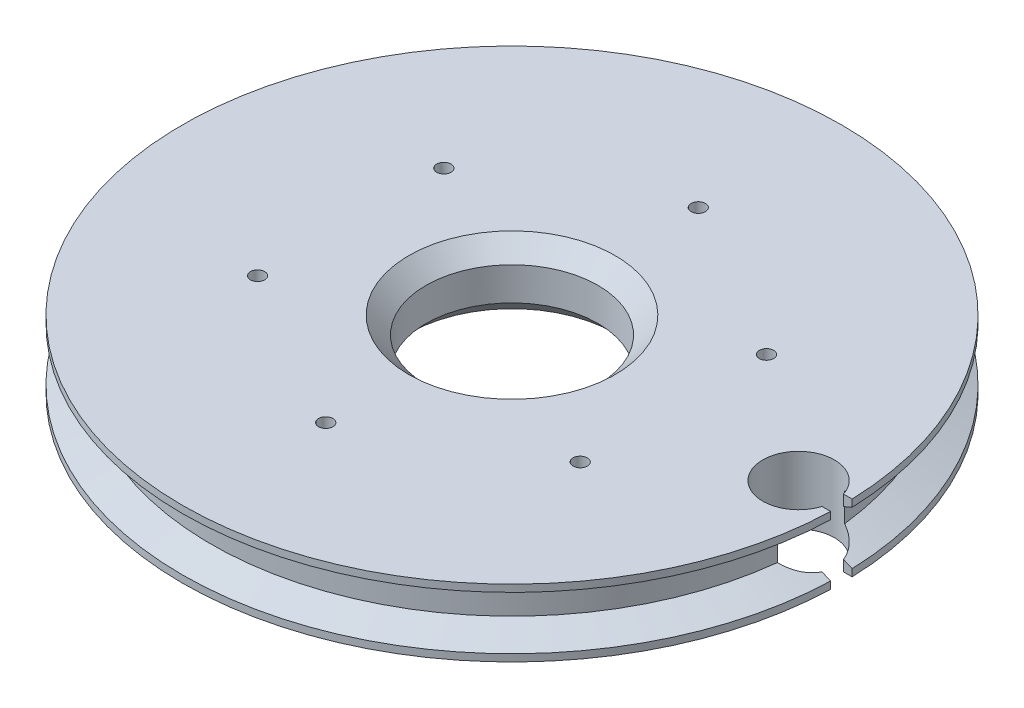
ISO-10303-21;
HEADER;
FILE_DESCRIPTION(('STEP AP214'),'2;1');
FILE_NAME('part.step','',(''),(''),'','','');
FILE_SCHEMA(('AUTOMOTIVE_DESIGN { 1 0 10303 214 1 1 1 1 }'));
ENDSEC;
DATA;
#1=APPLICATION_CONTEXT('core data for automotive mechanical design processes');
#2=APPLICATION_PROTOCOL_DEFINITION('international standard','automotive_design',2000,#1);
#3=PRODUCT_CONTEXT('',#1,'mechanical');
#4=PRODUCT('Part','Part','',(#3));
#5=PRODUCT_RELATED_PRODUCT_CATEGORY('part','',(#4));
#6=PRODUCT_DEFINITION_FORMATION('','',#4);
#7=PRODUCT_DEFINITION_CONTEXT('part definition',#1,'design');
#8=PRODUCT_DEFINITION('design','',#6,#7);
#9=PRODUCT_DEFINITION_SHAPE('','',#8);
#10=(LENGTH_UNIT() NAMED_UNIT(*) SI_UNIT(.MILLI.,.METRE.));
#11=(NAMED_UNIT(*) PLANE_ANGLE_UNIT() SI_UNIT($,.RADIAN.));
#12=(NAMED_UNIT(*) SI_UNIT($,.STERADIAN.) SOLID_ANGLE_UNIT());
#13=UNCERTAINTY_MEASURE_WITH_UNIT(LENGTH_MEASURE(1.E-05),#10,'distance_accuracy_value','');
#14=(GEOMETRIC_REPRESENTATION_CONTEXT(3) GLOBAL_UNCERTAINTY_ASSIGNED_CONTEXT((#13)) GLOBAL_UNIT_ASSIGNED_CONTEXT((#10,
#11,#12)) REPRESENTATION_CONTEXT('',''));
#15=CARTESIAN_POINT('',(0.,0.,0.));
#16=DIRECTION('',(0.,0.,1.));
#17=DIRECTION('',(1.,0.,0.));
#18=AXIS2_PLACEMENT_3D('',#15,#16,#17);
#19=CARTESIAN_POINT('',(0.,0.,0.));
#20=DIRECTION('',(0.,-1.,0.));
#21=DIRECTION('',(0.,0.,-1.));
#22=AXIS2_PLACEMENT_3D('',#19,#20,#21);
#23=CYLINDRICAL_SURFACE('',#22,23.);
#24=DIRECTION('',(0.,-1.,0.));
#25=VECTOR('',#24,1.);
#26=CARTESIAN_POINT('',(22.9877684867409,0.,0.75));
#27=LINE('',#26,#25);
#28=CARTESIAN_POINT('',(22.9877684867409,0.5,0.75));
#29=VERTEX_POINT('',#28);
#30=CARTESIAN_POINT('',(22.9877684867409,0.,0.75));
#31=VERTEX_POINT('',#30);
#32=EDGE_CURVE('E256',#29,#31,#27,.T.);
#33=ORIENTED_EDGE('',*,*,#32,.F.);
#34=CARTESIAN_POINT('',(0.,0.5,0.));
#35=DIRECTION('',(0.,-1.,0.));
#36=DIRECTION('',(0.,0.,-1.));
#37=AXIS2_PLACEMENT_3D('',#34,#35,#36);
#38=CIRCLE('',#37,23.);
#39=CARTESIAN_POINT('',(22.9877684867409,0.5,-0.75));
#40=VERTEX_POINT('',#39);
#41=EDGE_CURVE('E277',#29,#40,#38,.T.);
#42=ORIENTED_EDGE('',*,*,#41,.T.);
#43=DIRECTION('',(0.,-1.,0.));
#44=VECTOR('',#43,1.);
#45=CARTESIAN_POINT('',(22.9877684867409,0.,-0.75));
#46=LINE('',#45,#44);
#47=CARTESIAN_POINT('',(22.9877684867409,0.,-0.75));
#48=VERTEX_POINT('',#47);
#49=EDGE_CURVE('E230',#48,#40,#46,.F.);
#50=ORIENTED_EDGE('',*,*,#49,.F.);
#51=CARTESIAN_POINT('',(0.,0.,0.));
#52=DIRECTION('',(0.,-1.,0.));
#53=DIRECTION('',(0.,0.,-1.));
#54=AXIS2_PLACEMENT_3D('',#51,#52,#53);
#55=CIRCLE('',#54,23.);
#56=EDGE_CURVE('E147',#31,#48,#55,.T.);
#57=ORIENTED_EDGE('',*,*,#56,.F.);
#58=EDGE_LOOP('',(#33,#42,#50,#57));
#59=FACE_BOUND('',#58,.T.);
#60=ADVANCED_FACE('F45',(#59),#23,.T.);
#61=CARTESIAN_POINT('',(0.,0.5,0.));
#62=DIRECTION('',(0.,-1.,0.));
#63=DIRECTION('',(0.,0.,-1.));
#64=AXIS2_PLACEMENT_3D('',#61,#62,#63);
#65=CONICAL_SURFACE('',#64,23.,1.16780225186951);
#66=CARTESIAN_POINT('',(21.3332533313732,1.20496026768049,0.75));
#67=CARTESIAN_POINT('',(21.7863147876131,1.01192639389684,0.75));
#68=CARTESIAN_POINT('',(22.2393739608013,0.818887162012675,0.75));
#69=CARTESIAN_POINT('',(23.1454877410666,0.432797982046552,0.75));
#70=CARTESIAN_POINT('',(23.5985423481438,0.239748033964592,0.75));
#71=CARTESIAN_POINT('',(24.0515946721692,0.0466927277821181,0.75));
#72=B_SPLINE_CURVE_WITH_KNOTS('',3,(#66,#67,#68,#69,#70,#71),.UNSPECIFIED.,.F.,.F.,(4,2,4),(0.,
1.47741017835521,2.95482035668569),.UNSPECIFIED.);
#73=CARTESIAN_POINT('',(22.3848480035424,0.756900894631485,0.75));
#74=VERTEX_POINT('',#73);
#75=EDGE_CURVE('E69',#74,#29,#72,.T.);
#76=ORIENTED_EDGE('',*,*,#75,.F.);
#77=CARTESIAN_POINT('',(20.86825742584,1.35285396141693,2.34438244373089));
#78=CARTESIAN_POINT('',(20.9343838686618,1.32600390507805,2.31988898271518));
#79=CARTESIAN_POINT('',(20.9996184692873,1.29963770435361,2.29254799831685));
#80=CARTESIAN_POINT('',(21.1279073490888,1.24800386835234,2.23223198511199));
#81=CARTESIAN_POINT('',(21.1909609294085,1.22273658454211,2.19925517018102));
#82=CARTESIAN_POINT('',(21.3764647037545,1.14869603806449,2.09183096609812));
#83=CARTESIAN_POINT('',(21.4949625509167,1.1018037518114,2.00899841470817));
#84=CARTESIAN_POINT('',(21.7174622590679,1.01433963809259,1.82249308845904));
#85=CARTESIAN_POINT('',(21.8214258096384,0.97378448254109,1.71876693235532));
#86=CARTESIAN_POINT('',(22.0103904248338,0.900463263797329,1.49327055385154));
#87=CARTESIAN_POINT('',(22.095444916111,0.867675237289985,1.37155283089412));
#88=CARTESIAN_POINT('',(22.2137305950141,0.822252422358058,1.16507638746979));
#89=CARTESIAN_POINT('',(22.2541013255999,0.806795328009206,1.08493808680379));
#90=CARTESIAN_POINT('',(22.3262122490757,0.779239659967857,0.92023711392947));
#91=CARTESIAN_POINT('',(22.3579449014662,0.767144020422894,0.835670652497341));
#92=CARTESIAN_POINT('',(22.3850480035424,0.756824756309387,0.749363743984582));
#93=B_SPLINE_CURVE_WITH_KNOTS('',3,(#77,#78,#79,#80,#81,#82,#83,#84,#85,#86,#87,#88,#89,#90,#91,
#92),.UNSPECIFIED.,.F.,.F.,(4,2,2,2,2,2,2,4),(0.,0.226243199234564,0.45255823356417,
0.90618621851771,1.36098822686417,1.81448840398147,2.08712133593548,2.35999150163163),.UNSPECIFIED.);
#94=CARTESIAN_POINT('',(20.86875,1.35265396141692,2.34419995680829));
#95=VERTEX_POINT('',#94);
#96=EDGE_CURVE('E187',#95,#74,#93,.T.);
#97=ORIENTED_EDGE('',*,*,#96,.F.);
#98=CARTESIAN_POINT('',(0.,1.35265396141692,0.));
#99=DIRECTION('',(0.,-1.,0.));
#100=DIRECTION('',(0.,0.,-1.));
#101=AXIS2_PLACEMENT_3D('',#98,#99,#100);
#102=CIRCLE('',#101,21.);
#103=CARTESIAN_POINT('',(20.86875,1.35265396141692,-2.34419995680829));
#104=VERTEX_POINT('',#103);
#105=EDGE_CURVE('E273',#95,#104,#102,.T.);
#106=ORIENTED_EDGE('',*,*,#105,.T.);
#107=CARTESIAN_POINT('',(22.3850480035424,0.756824756309386,-0.749363743984582));
#108=CARTESIAN_POINT('',(22.3642574285548,0.764740028752363,-0.815564982536014));
#109=CARTESIAN_POINT('',(22.340732916199,0.773704917897505,-0.880771327202525));
#110=CARTESIAN_POINT('',(22.288498532743,0.793645839555162,-1.00873024737017));
#111=CARTESIAN_POINT('',(22.2597903623978,0.804621212446282,-1.07148361949935));
#112=CARTESIAN_POINT('',(22.1975835584395,0.828451901627934,-1.19386796380039));
#113=CARTESIAN_POINT('',(22.1641048184012,0.841299415770251,-1.25351056347023));
#114=CARTESIAN_POINT('',(22.0926028621352,0.868802385577968,-1.36954866632648));
#115=CARTESIAN_POINT('',(22.0545794315039,0.883457926541221,-1.42594401613211));
#116=CARTESIAN_POINT('',(21.9342515619929,0.929957873699891,-1.58964218202942));
#117=CARTESIAN_POINT('',(21.845588575421,0.964374134032152,-1.69165399494342));
#118=CARTESIAN_POINT('',(21.6542993424282,1.03911304832822,-1.87917009026088));
#119=CARTESIAN_POINT('',(21.5516575999844,1.07944226089469,-1.9646557946982));
#120=CARTESIAN_POINT('',(21.3539153292078,1.15771644991426,-2.10451501503221));
#121=CARTESIAN_POINT('',(21.2604886364592,1.19490558212753,-2.16170626633279));
#122=CARTESIAN_POINT('',(21.0681234540661,1.27198295223412,-2.26294802822615));
#123=CARTESIAN_POINT('',(20.9691986544856,1.31186453494508,-2.30702958223958));
#124=CARTESIAN_POINT('',(20.86825742584,1.35285396141693,-2.34438244373089));
#125=B_SPLINE_CURVE_WITH_KNOTS('',3,(#107,#108,#109,#110,#111,#112,#113,#114,#115,#116,#117,
#118,#119,#120,#121,#122,#123,#124),.UNSPECIFIED.,.F.,.F.,(4,2,2,2,2,2,2,2,4),(0.,
0.209433864614635,0.418799138558386,0.627315594817326,0.835841892087581,1.25222912941386,
1.66908176426493,2.01522974310224,2.36055140389814),.UNSPECIFIED.);
#126=CARTESIAN_POINT('',(22.3848480035424,0.756900894631485,-0.75));
#127=VERTEX_POINT('',#126);
#128=EDGE_CURVE('E203',#127,#104,#125,.T.);
#129=ORIENTED_EDGE('',*,*,#128,.F.);
#130=CARTESIAN_POINT('',(24.0515946721692,0.0466927277821198,-0.75));
#131=CARTESIAN_POINT('',(23.5985423481438,0.239748033964593,-0.75));
#132=CARTESIAN_POINT('',(23.1454877410666,0.432797982046552,-0.75));
#133=CARTESIAN_POINT('',(22.2393739608013,0.818887162012675,-0.75));
#134=CARTESIAN_POINT('',(21.7863147876131,1.01192639389684,-0.75));
#135=CARTESIAN_POINT('',(21.3332533313732,1.20496026768049,-0.75));
#136=B_SPLINE_CURVE_WITH_KNOTS('',3,(#130,#131,#132,#133,#134,#135),.UNSPECIFIED.,.F.,.F.,(4,2,
4),(0.,1.47741017833048,2.95482035668569),.UNSPECIFIED.);
#137=EDGE_CURVE('E130',#40,#127,#136,.T.);
#138=ORIENTED_EDGE('',*,*,#137,.F.);
#139=ORIENTED_EDGE('',*,*,#41,.F.);
#140=EDGE_LOOP('',(#76,#97,#106,#129,#138,#139));
#141=FACE_BOUND('',#140,.T.);
#142=ADVANCED_FACE('F212',(#141),#65,.T.);
#143=CARTESIAN_POINT('',(0.,0.,0.));
#144=DIRECTION('',(0.,-1.,0.));
#145=DIRECTION('',(0.,0.,-1.));
#146=AXIS2_PLACEMENT_3D('',#143,#144,#145);
#147=CYLINDRICAL_SURFACE('',#146,21.);
#148=DIRECTION('',(0.,-1.,0.));
#149=VECTOR('',#148,1.);
#150=CARTESIAN_POINT('',(20.86875,5.,2.34419995680829));
#151=LINE('',#150,#149);
#152=CARTESIAN_POINT('',(20.86875,3.35265396141692,2.3441999568083));
#153=VERTEX_POINT('',#152);
#154=EDGE_CURVE('E166',#153,#95,#151,.T.);
#155=ORIENTED_EDGE('',*,*,#154,.F.);
#156=CARTESIAN_POINT('',(0.,3.35265396141692,0.));
#157=DIRECTION('',(0.,-1.,0.));
#158=DIRECTION('',(0.,0.,-1.));
#159=AXIS2_PLACEMENT_3D('',#156,#157,#158);
#160=CIRCLE('',#159,21.);
#161=CARTESIAN_POINT('',(20.86875,3.35265396141692,-2.3441999568083));
#162=VERTEX_POINT('',#161);
#163=EDGE_CURVE('E269',#153,#162,#160,.T.);
#164=ORIENTED_EDGE('',*,*,#163,.T.);
#165=DIRECTION('',(0.,-1.,0.));
#166=VECTOR('',#165,1.);
#167=CARTESIAN_POINT('',(20.86875,5.,-2.34419995680829));
#168=LINE('',#167,#166);
#169=EDGE_CURVE('E201',#104,#162,#168,.F.);
#170=ORIENTED_EDGE('',*,*,#169,.F.);
#171=ORIENTED_EDGE('',*,*,#105,.F.);
#172=EDGE_LOOP('',(#155,#164,#170,#171));
#173=FACE_BOUND('',#172,.T.);
#174=ADVANCED_FACE('F216',(#173),#147,.T.);
#175=CARTESIAN_POINT('',(0.,3.35265396141692,0.));
#176=DIRECTION('',(0.,1.,0.));
#177=DIRECTION('',(0.,0.,1.));
#178=AXIS2_PLACEMENT_3D('',#175,#176,#177);
#179=CONICAL_SURFACE('',#178,21.,1.16780225186951);
#180=CARTESIAN_POINT('',(21.3332533313732,3.50034765515336,-0.75));
#181=CARTESIAN_POINT('',(21.7863147876131,3.69338152893701,-0.75));
#182=CARTESIAN_POINT('',(22.2393739608013,3.88642076082117,-0.75));
#183=CARTESIAN_POINT('',(23.1454877410666,4.27250994078729,-0.75));
#184=CARTESIAN_POINT('',(23.5985423481438,4.46555988886925,-0.75));
#185=CARTESIAN_POINT('',(24.0515946721692,4.65861519505173,-0.75));
#186=B_SPLINE_CURVE_WITH_KNOTS('',3,(#180,#181,#182,#183,#184,#185),.UNSPECIFIED.,.F.,.F.,(4,2,
4),(0.,1.47741017835521,2.9548203566857),.UNSPECIFIED.);
#187=CARTESIAN_POINT('',(22.3848480035424,3.94840702820236,-0.75));
#188=VERTEX_POINT('',#187);
#189=CARTESIAN_POINT('',(22.9877684867409,4.20530792283385,-0.75));
#190=VERTEX_POINT('',#189);
#191=EDGE_CURVE('E231',#188,#190,#186,.T.);
#192=ORIENTED_EDGE('',*,*,#191,.F.);
#193=CARTESIAN_POINT('',(20.86825742584,3.35245396141692,-2.34438244373089));
#194=CARTESIAN_POINT('',(20.9343838686618,3.37930401775579,-2.31988898271518));
#195=CARTESIAN_POINT('',(20.9996184692873,3.40567021848023,-2.29254799831685));
#196=CARTESIAN_POINT('',(21.1279073490888,3.4573040544815,-2.23223198511199));
#197=CARTESIAN_POINT('',(21.1909609294085,3.48257133829173,-2.19925517018102));
#198=CARTESIAN_POINT('',(21.3764647037545,3.55661188476935,-2.09183096609812));
#199=CARTESIAN_POINT('',(21.4949625509167,3.60350417102245,-2.00899841470817));
#200=CARTESIAN_POINT('',(21.7174622590679,3.69096828474126,-1.82249308845904));
#201=CARTESIAN_POINT('',(21.8214258096384,3.73152344029275,-1.71876693235532));
#202=CARTESIAN_POINT('',(22.0103904248338,3.80484465903652,-1.49327055385154));
#203=CARTESIAN_POINT('',(22.095444916111,3.83763268554386,-1.37155283089412));
#204=CARTESIAN_POINT('',(22.2137305950141,3.88305550047579,-1.16507638746979));
#205=CARTESIAN_POINT('',(22.2541013255999,3.89851259482464,-1.08493808680379));
#206=CARTESIAN_POINT('',(22.3262122490757,3.92606826286599,-0.92023711392947));
#207=CARTESIAN_POINT('',(22.3579449014662,3.93816390241095,-0.835670652497341));
#208=CARTESIAN_POINT('',(22.3850480035424,3.94848316652446,-0.749363743984582));
#209=B_SPLINE_CURVE_WITH_KNOTS('',3,(#193,#194,#195,#196,#197,#198,#199,#200,#201,#202,#203,
#204,#205,#206,#207,#208),.UNSPECIFIED.,.F.,.F.,(4,2,2,2,2,2,2,4),(0.,0.226243199234564,
0.45255823356417,0.90618621851771,1.36098822686417,1.81448840398147,2.08712133593548,
2.35999150163163),.UNSPECIFIED.);
#210=EDGE_CURVE('E194',#162,#188,#209,.T.);
#211=ORIENTED_EDGE('',*,*,#210,.F.);
#212=ORIENTED_EDGE('',*,*,#163,.F.);
#213=CARTESIAN_POINT('',(22.3850480035424,3.94848316652446,0.749363743984583));
#214=CARTESIAN_POINT('',(22.3642574285548,3.94056789408148,0.815564982536014));
#215=CARTESIAN_POINT('',(22.340732916199,3.93160300493634,0.880771327202525));
#216=CARTESIAN_POINT('',(22.288498532743,3.91166208327868,1.00873024737017));
#217=CARTESIAN_POINT('',(22.2597903623978,3.90068671038756,1.07148361949935));
#218=CARTESIAN_POINT('',(22.1975835584395,3.87685602120591,1.19386796380039));
#219=CARTESIAN_POINT('',(22.1641048184012,3.86400850706359,1.25351056347023));
#220=CARTESIAN_POINT('',(22.0926028621352,3.83650553725588,1.36954866632648));
#221=CARTESIAN_POINT('',(22.0545794315039,3.82184999629262,1.42594401613211));
#222=CARTESIAN_POINT('',(21.9342515619929,3.77535004913396,1.58964218202941));
#223=CARTESIAN_POINT('',(21.845588575421,3.74093378880169,1.69165399494342));
#224=CARTESIAN_POINT('',(21.6542993424282,3.66619487450563,1.87917009026087));
#225=CARTESIAN_POINT('',(21.5516575999844,3.62586566193916,1.9646557946982));
#226=CARTESIAN_POINT('',(21.3539153292078,3.54759147291958,2.1045150150322));
#227=CARTESIAN_POINT('',(21.2604886364592,3.51040234070632,2.16170626633278));
#228=CARTESIAN_POINT('',(21.0681234540661,3.43332497059972,2.26294802822615));
#229=CARTESIAN_POINT('',(20.9691986544856,3.39344338788877,2.30702958223958));
#230=CARTESIAN_POINT('',(20.86825742584,3.35245396141692,2.34438244373089));
#231=B_SPLINE_CURVE_WITH_KNOTS('',3,(#213,#214,#215,#216,#217,#218,#219,#220,#221,#222,#223,
#224,#225,#226,#227,#228,#229,#230),.UNSPECIFIED.,.F.,.F.,(4,2,2,2,2,2,2,2,4),(0.,
0.209433864614634,0.418799138558385,0.627315594817325,0.83584189208758,1.25222912941386,
1.66908176426493,2.01522974310223,2.36055140389814),.UNSPECIFIED.);
#232=CARTESIAN_POINT('',(22.3848480035424,3.94840702820236,0.75));
#233=VERTEX_POINT('',#232);
#234=EDGE_CURVE('E157',#233,#153,#231,.T.);
#235=ORIENTED_EDGE('',*,*,#234,.F.);
#236=CARTESIAN_POINT('',(24.0515946721692,4.65861519505173,0.75));
#237=CARTESIAN_POINT('',(23.5985423481438,4.46555988886926,0.75));
#238=CARTESIAN_POINT('',(23.1454877410666,4.2725099407873,0.75));
#239=CARTESIAN_POINT('',(22.2393739608013,3.88642076082117,0.75));
#240=CARTESIAN_POINT('',(21.7863147876131,3.69338152893701,0.75));
#241=CARTESIAN_POINT('',(21.3332533313732,3.50034765515336,0.75));
#242=B_SPLINE_CURVE_WITH_KNOTS('',3,(#236,#237,#238,#239,#240,#241),.UNSPECIFIED.,.F.,.F.,(4,2,
4),(0.,1.47741017833049,2.9548203566857),.UNSPECIFIED.);
#243=CARTESIAN_POINT('',(22.9877684867409,4.20530792283385,0.75));
#244=VERTEX_POINT('',#243);
#245=EDGE_CURVE('E244',#244,#233,#242,.T.);
#246=ORIENTED_EDGE('',*,*,#245,.F.);
#247=CARTESIAN_POINT('',(0.,4.20530792283385,0.));
#248=DIRECTION('',(0.,-1.,0.));
#249=DIRECTION('',(0.,0.,-1.));
#250=AXIS2_PLACEMENT_3D('',#247,#248,#249);
#251=CIRCLE('',#250,23.);
#252=EDGE_CURVE('E265',#244,#190,#251,.T.);
#253=ORIENTED_EDGE('',*,*,#252,.T.);
#254=EDGE_LOOP('',(#192,#211,#212,#235,#246,#253));
#255=FACE_BOUND('',#254,.T.);
#256=ADVANCED_FACE('F168',(#255),#179,.T.);
#257=CARTESIAN_POINT('',(0.,0.,0.));
#258=DIRECTION('',(0.,-1.,0.));
#259=DIRECTION('',(0.,0.,-1.));
#260=AXIS2_PLACEMENT_3D('',#257,#258,#259);
#261=CYLINDRICAL_SURFACE('',#260,23.);
#262=DIRECTION('',(0.,-1.,0.));
#263=VECTOR('',#262,1.);
#264=CARTESIAN_POINT('',(22.9877684867409,0.,0.75));
#265=LINE('',#264,#263);
#266=CARTESIAN_POINT('',(22.9877684867409,4.70530792283385,0.75));
#267=VERTEX_POINT('',#266);
#268=EDGE_CURVE('E241',#267,#244,#265,.T.);
#269=ORIENTED_EDGE('',*,*,#268,.F.);
#270=CARTESIAN_POINT('',(0.,4.70530792283385,0.));
#271=DIRECTION('',(0.,-1.,0.));
#272=DIRECTION('',(0.,0.,-1.));
#273=AXIS2_PLACEMENT_3D('',#270,#271,#272);
#274=CIRCLE('',#273,23.);
#275=CARTESIAN_POINT('',(22.9877684867409,4.70530792283385,-0.75));
#276=VERTEX_POINT('',#275);
#277=EDGE_CURVE('E261',#267,#276,#274,.T.);
#278=ORIENTED_EDGE('',*,*,#277,.T.);
#279=DIRECTION('',(0.,-1.,0.));
#280=VECTOR('',#279,1.);
#281=CARTESIAN_POINT('',(22.9877684867409,0.,-0.75));
#282=LINE('',#281,#280);
#283=EDGE_CURVE('E329',#190,#276,#282,.F.);
#284=ORIENTED_EDGE('',*,*,#283,.F.);
#285=ORIENTED_EDGE('',*,*,#252,.F.);
#286=EDGE_LOOP('',(#269,#278,#284,#285));
#287=FACE_BOUND('',#286,.T.);
#288=ADVANCED_FACE('F314',(#287),#261,.T.);
#289=CARTESIAN_POINT('',(23.,4.70530792283385,0.));
#290=DIRECTION('',(0.,1.,0.));
#291=DIRECTION('',(0.,0.,1.));
#292=AXIS2_PLACEMENT_3D('',#289,#290,#291);
#293=PLANE('',#292);
#294=CARTESIAN_POINT('',(0.,4.70530792283385,-13.));
#295=DIRECTION('',(0.,1.,0.));
#296=DIRECTION('',(0.,0.,1.));
#297=AXIS2_PLACEMENT_3D('',#294,#295,#296);
#298=CIRCLE('',#297,0.5);
#299=CARTESIAN_POINT('',(0.,4.70530792283385,-12.5));
#300=VERTEX_POINT('',#299);
#301=EDGE_CURVE('E142',#300,#300,#298,.T.);
#302=ORIENTED_EDGE('',*,*,#301,.F.);
#303=EDGE_LOOP('',(#302));
#304=FACE_BOUND('',#303,.T.);
#305=CARTESIAN_POINT('',(-11.2583302491969,4.70530792283385,-6.50000000000048));
#306=DIRECTION('',(0.,1.,0.));
#307=DIRECTION('',(0.,0.,1.));
#308=AXIS2_PLACEMENT_3D('',#305,#306,#307);
#309=CIRCLE('',#308,0.500000000000591);
#310=CARTESIAN_POINT('',(-11.2583302491969,4.70530792283385,-5.99999999999988));
#311=VERTEX_POINT('',#310);
#312=EDGE_CURVE('E518',#311,#311,#309,.T.);
#313=ORIENTED_EDGE('',*,*,#312,.F.);
#314=EDGE_LOOP('',(#313));
#315=FACE_BOUND('',#314,.T.);
#316=CARTESIAN_POINT('',(-11.2583302491974,4.70530792283385,6.49999999999952));
#317=DIRECTION('',(0.,1.,0.));
#318=DIRECTION('',(0.,0.,1.));
#319=AXIS2_PLACEMENT_3D('',#316,#317,#318);
#320=CIRCLE('',#319,0.500000000000093);
#321=CARTESIAN_POINT('',(-11.2583302491974,4.70530792283385,6.99999999999962));
#322=VERTEX_POINT('',#321);
#323=EDGE_CURVE('E514',#322,#322,#320,.T.);
#324=ORIENTED_EDGE('',*,*,#323,.F.);
#325=EDGE_LOOP('',(#324));
#326=FACE_BOUND('',#325,.T.);
#327=CARTESIAN_POINT('',(11.258330249198,4.70530792283385,-6.50000000000048));
#328=DIRECTION('',(0.,1.,0.));
#329=DIRECTION('',(0.,0.,1.));
#330=AXIS2_PLACEMENT_3D('',#327,#328,#329);
#331=CIRCLE('',#330,0.500000000000155);
#332=CARTESIAN_POINT('',(11.258330249198,4.70530792283385,-6.00000000000032));
#333=VERTEX_POINT('',#332);
#334=EDGE_CURVE('E510',#333,#333,#331,.T.);
#335=ORIENTED_EDGE('',*,*,#334,.F.);
#336=EDGE_LOOP('',(#335));
#337=FACE_BOUND('',#336,.T.);
#338=CARTESIAN_POINT('',(11.2583302491985,4.70530792283385,6.49999999999952));
#339=DIRECTION('',(0.,1.,0.));
#340=DIRECTION('',(0.,0.,1.));
#341=AXIS2_PLACEMENT_3D('',#338,#339,#340);
#342=CIRCLE('',#341,0.500000000000713);
#343=CARTESIAN_POINT('',(11.2583302491985,4.70530792283385,7.00000000000023));
#344=VERTEX_POINT('',#343);
#345=EDGE_CURVE('E486',#344,#344,#342,.T.);
#346=ORIENTED_EDGE('',*,*,#345,.F.);
#347=EDGE_LOOP('',(#346));
#348=FACE_BOUND('',#347,.T.);
#349=CARTESIAN_POINT('',(0.,4.70530792283385,13.));
#350=DIRECTION('',(0.,1.,0.));
#351=DIRECTION('',(0.,0.,1.));
#352=AXIS2_PLACEMENT_3D('',#349,#350,#351);
#353=CIRCLE('',#352,0.500000000000001);
#354=CARTESIAN_POINT('',(0.,4.70530792283385,13.5));
#355=VERTEX_POINT('',#354);
#356=EDGE_CURVE('E480',#355,#355,#353,.T.);
#357=ORIENTED_EDGE('',*,*,#356,.F.);
#358=EDGE_LOOP('',(#357));
#359=FACE_BOUND('',#358,.T.);
#360=CARTESIAN_POINT('',(0.,4.70530792283385,0.));
#361=DIRECTION('',(0.,1.,0.));
#362=DIRECTION('',(0.,0.,1.));
#363=AXIS2_PLACEMENT_3D('',#360,#361,#362);
#364=CIRCLE('',#363,7.2);
#365=CARTESIAN_POINT('',(0.,4.70530792283385,7.2));
#366=VERTEX_POINT('',#365);
#367=EDGE_CURVE('E11',#366,#366,#364,.F.);
#368=ORIENTED_EDGE('',*,*,#367,.T.);
#369=EDGE_LOOP('',(#368));
#370=FACE_BOUND('',#369,.T.);
#371=DIRECTION('',(1.,0.,0.));
#372=VECTOR('',#371,1.);
#373=CARTESIAN_POINT('',(23.,4.70530792283385,0.75));
#374=LINE('',#373,#372);
#375=CARTESIAN_POINT('',(22.3848480035424,4.70530792283385,0.75));
#376=VERTEX_POINT('',#375);
#377=EDGE_CURVE('E238',#376,#267,#374,.T.);
#378=ORIENTED_EDGE('',*,*,#377,.F.);
#379=CARTESIAN_POINT('',(20.,4.70530792283385,0.));
#380=DIRECTION('',(0.,1.,0.));
#381=DIRECTION('',(0.,0.,1.));
#382=AXIS2_PLACEMENT_3D('',#379,#380,#381);
#383=CIRCLE('',#382,2.5);
#384=CARTESIAN_POINT('',(22.3848480035424,4.70530792283385,-0.75));
#385=VERTEX_POINT('',#384);
#386=EDGE_CURVE('E154',#385,#376,#383,.T.);
#387=ORIENTED_EDGE('',*,*,#386,.F.);
#388=DIRECTION('',(-1.,0.,0.));
#389=VECTOR('',#388,1.);
#390=CARTESIAN_POINT('',(23.,4.70530792283385,-0.75));
#391=LINE('',#390,#389);
#392=EDGE_CURVE('E210',#276,#385,#391,.T.);
#393=ORIENTED_EDGE('',*,*,#392,.F.);
#394=ORIENTED_EDGE('',*,*,#277,.F.);
#395=EDGE_LOOP('',(#378,#387,#393,#394));
#396=FACE_BOUND('',#395,.T.);
#397=ADVANCED_FACE('F303',(#304,#315,#326,#337,#348,#359,#370,#396),#293,.T.);
#398=CARTESIAN_POINT('',(0.,0.,0.));
#399=DIRECTION('',(0.,-1.,0.));
#400=DIRECTION('',(0.,0.,-1.));
#401=AXIS2_PLACEMENT_3D('',#398,#399,#400);
#402=CYLINDRICAL_SURFACE('',#401,6.);
#403=CARTESIAN_POINT('',(0.,1.2,0.));
#404=DIRECTION('',(0.,-1.,0.));
#405=DIRECTION('',(0.,0.,-1.));
#406=AXIS2_PLACEMENT_3D('',#403,#404,#405);
#407=CIRCLE('',#406,6.);
#408=CARTESIAN_POINT('',(0.,1.2,-6.));
#409=VERTEX_POINT('',#408);
#410=EDGE_CURVE('E288',#409,#409,#407,.T.);
#411=ORIENTED_EDGE('',*,*,#410,.T.);
#412=EDGE_LOOP('',(#411));
#413=FACE_BOUND('',#412,.T.);
#414=CARTESIAN_POINT('',(0.,3.50530792283384,0.));
#415=DIRECTION('',(0.,1.,0.));
#416=DIRECTION('',(0.,0.,1.));
#417=AXIS2_PLACEMENT_3D('',#414,#415,#416);
#418=CIRCLE('',#417,6.);
#419=CARTESIAN_POINT('',(0.,3.50530792283384,6.));
#420=VERTEX_POINT('',#419);
#421=EDGE_CURVE('E284',#420,#420,#418,.T.);
#422=ORIENTED_EDGE('',*,*,#421,.T.);
#423=EDGE_LOOP('',(#422));
#424=FACE_BOUND('',#423,.T.);
#425=ADVANCED_FACE('F300',(#413,#424),#402,.F.);
#426=CARTESIAN_POINT('',(6.,0.,0.));
#427=DIRECTION('',(0.,-1.,0.));
#428=DIRECTION('',(0.,0.,-1.));
#429=AXIS2_PLACEMENT_3D('',#426,#427,#428);
#430=PLANE('',#429);
#431=CARTESIAN_POINT('',(0.,0.,-13.));
#432=DIRECTION('',(0.,1.,0.));
#433=DIRECTION('',(0.,0.,1.));
#434=AXIS2_PLACEMENT_3D('',#431,#432,#433);
#435=CIRCLE('',#434,0.5);
#436=CARTESIAN_POINT('',(0.,0.,-12.5));
#437=VERTEX_POINT('',#436);
#438=EDGE_CURVE('E478',#437,#437,#435,.T.);
#439=ORIENTED_EDGE('',*,*,#438,.T.);
#440=EDGE_LOOP('',(#439));
#441=FACE_BOUND('',#440,.T.);
#442=CARTESIAN_POINT('',(-11.2583302491969,0.,-6.50000000000048));
#443=DIRECTION('',(0.,1.,0.));
#444=DIRECTION('',(0.,0.,1.));
#445=AXIS2_PLACEMENT_3D('',#442,#443,#444);
#446=CIRCLE('',#445,0.500000000000591);
#447=CARTESIAN_POINT('',(-11.2583302491969,0.,-5.99999999999988));
#448=VERTEX_POINT('',#447);
#449=EDGE_CURVE('E481',#448,#448,#446,.T.);
#450=ORIENTED_EDGE('',*,*,#449,.T.);
#451=EDGE_LOOP('',(#450));
#452=FACE_BOUND('',#451,.T.);
#453=CARTESIAN_POINT('',(-11.2583302491974,0.,6.49999999999952));
#454=DIRECTION('',(0.,1.,0.));
#455=DIRECTION('',(0.,0.,1.));
#456=AXIS2_PLACEMENT_3D('',#453,#454,#455);
#457=CIRCLE('',#456,0.500000000000093);
#458=CARTESIAN_POINT('',(-11.2583302491974,0.,6.99999999999962));
#459=VERTEX_POINT('',#458);
#460=EDGE_CURVE('E489',#459,#459,#457,.T.);
#461=ORIENTED_EDGE('',*,*,#460,.T.);
#462=EDGE_LOOP('',(#461));
#463=FACE_BOUND('',#462,.T.);
#464=CARTESIAN_POINT('',(11.258330249198,0.,-6.50000000000048));
#465=DIRECTION('',(0.,1.,0.));
#466=DIRECTION('',(0.,0.,1.));
#467=AXIS2_PLACEMENT_3D('',#464,#465,#466);
#468=CIRCLE('',#467,0.500000000000155);
#469=CARTESIAN_POINT('',(11.258330249198,0.,-6.00000000000032));
#470=VERTEX_POINT('',#469);
#471=EDGE_CURVE('E495',#470,#470,#468,.T.);
#472=ORIENTED_EDGE('',*,*,#471,.T.);
#473=EDGE_LOOP('',(#472));
#474=FACE_BOUND('',#473,.T.);
#475=CARTESIAN_POINT('',(11.2583302491985,0.,6.49999999999952));
#476=DIRECTION('',(0.,1.,0.));
#477=DIRECTION('',(0.,0.,1.));
#478=AXIS2_PLACEMENT_3D('',#475,#476,#477);
#479=CIRCLE('',#478,0.500000000000713);
#480=CARTESIAN_POINT('',(11.2583302491985,0.,7.00000000000023));
#481=VERTEX_POINT('',#480);
#482=EDGE_CURVE('E499',#481,#481,#479,.T.);
#483=ORIENTED_EDGE('',*,*,#482,.T.);
#484=EDGE_LOOP('',(#483));
#485=FACE_BOUND('',#484,.T.);
#486=CARTESIAN_POINT('',(0.,0.,13.));
#487=DIRECTION('',(0.,1.,0.));
#488=DIRECTION('',(0.,0.,1.));
#489=AXIS2_PLACEMENT_3D('',#486,#487,#488);
#490=CIRCLE('',#489,0.500000000000001);
#491=CARTESIAN_POINT('',(0.,0.,13.5));
#492=VERTEX_POINT('',#491);
#493=EDGE_CURVE('E503',#492,#492,#490,.T.);
#494=ORIENTED_EDGE('',*,*,#493,.T.);
#495=EDGE_LOOP('',(#494));
#496=FACE_BOUND('',#495,.T.);
#497=CARTESIAN_POINT('',(0.,0.,0.));
#498=DIRECTION('',(0.,-1.,0.));
#499=DIRECTION('',(0.,0.,-1.));
#500=AXIS2_PLACEMENT_3D('',#497,#498,#499);
#501=CIRCLE('',#500,7.2);
#502=CARTESIAN_POINT('',(0.,0.,-7.2));
#503=VERTEX_POINT('',#502);
#504=EDGE_CURVE('E55',#503,#503,#501,.F.);
#505=ORIENTED_EDGE('',*,*,#504,.T.);
#506=EDGE_LOOP('',(#505));
#507=FACE_BOUND('',#506,.T.);
#508=DIRECTION('',(-1.,0.,0.));
#509=VECTOR('',#508,1.);
#510=CARTESIAN_POINT('',(6.,0.,0.75));
#511=LINE('',#510,#509);
#512=CARTESIAN_POINT('',(22.3848480035424,0.,0.75));
#513=VERTEX_POINT('',#512);
#514=EDGE_CURVE('E281',#31,#513,#511,.T.);
#515=ORIENTED_EDGE('',*,*,#514,.F.);
#516=ORIENTED_EDGE('',*,*,#56,.T.);
#517=DIRECTION('',(1.,0.,0.));
#518=VECTOR('',#517,1.);
#519=CARTESIAN_POINT('',(23.1150470229282,0.,-0.75));
#520=LINE('',#519,#518);
#521=CARTESIAN_POINT('',(22.3848480035424,0.,-0.75));
#522=VERTEX_POINT('',#521);
#523=EDGE_CURVE('E127',#522,#48,#520,.T.);
#524=ORIENTED_EDGE('',*,*,#523,.F.);
#525=CARTESIAN_POINT('',(20.,0.,0.));
#526=DIRECTION('',(0.,-1.,0.));
#527=DIRECTION('',(1.,0.,0.));
#528=AXIS2_PLACEMENT_3D('',#525,#526,#527);
#529=CIRCLE('',#528,2.5);
#530=EDGE_CURVE('E137',#513,#522,#529,.T.);
#531=ORIENTED_EDGE('',*,*,#530,.F.);
#532=EDGE_LOOP('',(#515,#516,#524,#531));
#533=FACE_BOUND('',#532,.T.);
#534=ADVANCED_FACE('F145',(#441,#452,#463,#474,#485,#496,#507,#533),#430,.T.);
#535=CARTESIAN_POINT('',(23.1150470229282,10.,0.75));
#536=DIRECTION('',(0.,0.,1.));
#537=DIRECTION('',(1.,0.,0.));
#538=AXIS2_PLACEMENT_3D('',#535,#536,#537);
#539=PLANE('',#538);
#540=ORIENTED_EDGE('',*,*,#32,.T.);
#541=ORIENTED_EDGE('',*,*,#514,.T.);
#542=DIRECTION('',(0.,-1.,0.));
#543=VECTOR('',#542,1.);
#544=CARTESIAN_POINT('',(22.3848480035424,10.,0.75));
#545=LINE('',#544,#543);
#546=EDGE_CURVE('E62',#74,#513,#545,.T.);
#547=ORIENTED_EDGE('',*,*,#546,.F.);
#548=ORIENTED_EDGE('',*,*,#75,.T.);
#549=EDGE_LOOP('',(#540,#541,#547,#548));
#550=FACE_BOUND('',#549,.T.);
#551=ADVANCED_FACE('F352',(#550),#539,.F.);
#552=CARTESIAN_POINT('',(23.1150470229282,10.,-0.75));
#553=DIRECTION('',(0.,0.,-1.));
#554=DIRECTION('',(-1.,0.,0.));
#555=AXIS2_PLACEMENT_3D('',#552,#553,#554);
#556=PLANE('',#555);
#557=ORIENTED_EDGE('',*,*,#49,.T.);
#558=ORIENTED_EDGE('',*,*,#137,.T.);
#559=DIRECTION('',(0.,-1.,0.));
#560=VECTOR('',#559,1.);
#561=CARTESIAN_POINT('',(22.3848480035424,10.,-0.75));
#562=LINE('',#561,#560);
#563=EDGE_CURVE('E124',#127,#522,#562,.T.);
#564=ORIENTED_EDGE('',*,*,#563,.T.);
#565=ORIENTED_EDGE('',*,*,#523,.T.);
#566=EDGE_LOOP('',(#557,#558,#564,#565));
#567=FACE_BOUND('',#566,.T.);
#568=ADVANCED_FACE('F125',(#567),#556,.F.);
#569=ORIENTED_EDGE('',*,*,#245,.T.);
#570=EDGE_CURVE('E134',#376,#233,#545,.T.);
#571=ORIENTED_EDGE('',*,*,#570,.F.);
#572=ORIENTED_EDGE('',*,*,#377,.T.);
#573=ORIENTED_EDGE('',*,*,#268,.T.);
#574=EDGE_LOOP('',(#569,#571,#572,#573));
#575=FACE_BOUND('',#574,.T.);
#576=ADVANCED_FACE('F180',(#575),#539,.F.);
#577=ORIENTED_EDGE('',*,*,#191,.T.);
#578=ORIENTED_EDGE('',*,*,#283,.T.);
#579=ORIENTED_EDGE('',*,*,#392,.T.);
#580=EDGE_CURVE('E133',#385,#188,#562,.T.);
#581=ORIENTED_EDGE('',*,*,#580,.T.);
#582=EDGE_LOOP('',(#577,#578,#579,#581));
#583=FACE_BOUND('',#582,.T.);
#584=ADVANCED_FACE('F177',(#583),#556,.F.);
#585=CARTESIAN_POINT('',(20.,10.,0.));
#586=DIRECTION('',(0.,-1.,0.));
#587=DIRECTION('',(1.,0.,0.));
#588=AXIS2_PLACEMENT_3D('',#585,#586,#587);
#589=CYLINDRICAL_SURFACE('',#588,2.5);
#590=ORIENTED_EDGE('',*,*,#128,.T.);
#591=ORIENTED_EDGE('',*,*,#169,.T.);
#592=ORIENTED_EDGE('',*,*,#210,.T.);
#593=ORIENTED_EDGE('',*,*,#580,.F.);
#594=ORIENTED_EDGE('',*,*,#386,.T.);
#595=ORIENTED_EDGE('',*,*,#570,.T.);
#596=ORIENTED_EDGE('',*,*,#234,.T.);
#597=ORIENTED_EDGE('',*,*,#154,.T.);
#598=ORIENTED_EDGE('',*,*,#96,.T.);
#599=ORIENTED_EDGE('',*,*,#546,.T.);
#600=ORIENTED_EDGE('',*,*,#530,.T.);
#601=ORIENTED_EDGE('',*,*,#563,.F.);
#602=EDGE_LOOP('',(#590,#591,#592,#593,#594,#595,#596,#597,#598,#599,#600,#601));
#603=FACE_BOUND('',#602,.T.);
#604=ADVANCED_FACE('F138',(#603),#589,.F.);
#605=CARTESIAN_POINT('',(0.,1.2,0.));
#606=DIRECTION('',(0.,-1.,0.));
#607=DIRECTION('',(0.,0.,-1.));
#608=AXIS2_PLACEMENT_3D('',#605,#606,#607);
#609=CONICAL_SURFACE('',#608,6.,0.785398163397449);
#610=ORIENTED_EDGE('',*,*,#504,.F.);
#611=EDGE_LOOP('',(#610));
#612=FACE_BOUND('',#611,.T.);
#613=ORIENTED_EDGE('',*,*,#410,.F.);
#614=EDGE_LOOP('',(#613));
#615=FACE_BOUND('',#614,.T.);
#616=ADVANCED_FACE('F176',(#612,#615),#609,.F.);
#617=CARTESIAN_POINT('',(0.,4.70530792283385,0.));
#618=DIRECTION('',(0.,1.,0.));
#619=DIRECTION('',(0.,0.,1.));
#620=AXIS2_PLACEMENT_3D('',#617,#618,#619);
#621=CONICAL_SURFACE('',#620,7.2,0.785398163397446);
#622=ORIENTED_EDGE('',*,*,#421,.F.);
#623=EDGE_LOOP('',(#622));
#624=FACE_BOUND('',#623,.T.);
#625=ORIENTED_EDGE('',*,*,#367,.F.);
#626=EDGE_LOOP('',(#625));
#627=FACE_BOUND('',#626,.T.);
#628=ADVANCED_FACE('F48',(#624,#627),#621,.F.);
#629=CARTESIAN_POINT('',(0.,0.,13.));
#630=DIRECTION('',(0.,1.,0.));
#631=DIRECTION('',(0.,0.,1.));
#632=AXIS2_PLACEMENT_3D('',#629,#630,#631);
#633=CYLINDRICAL_SURFACE('',#632,0.500000000000001);
#634=ORIENTED_EDGE('',*,*,#356,.T.);
#635=EDGE_LOOP('',(#634));
#636=FACE_BOUND('',#635,.T.);
#637=ORIENTED_EDGE('',*,*,#493,.F.);
#638=EDGE_LOOP('',(#637));
#639=FACE_BOUND('',#638,.T.);
#640=ADVANCED_FACE('F309',(#636,#639),#633,.F.);
#641=CARTESIAN_POINT('',(11.2583302491985,0.,6.49999999999952));
#642=DIRECTION('',(0.,1.,0.));
#643=DIRECTION('',(0.,0.,1.));
#644=AXIS2_PLACEMENT_3D('',#641,#642,#643);
#645=CYLINDRICAL_SURFACE('',#644,0.500000000000713);
#646=ORIENTED_EDGE('',*,*,#345,.T.);
#647=EDGE_LOOP('',(#646));
#648=FACE_BOUND('',#647,.T.);
#649=ORIENTED_EDGE('',*,*,#482,.F.);
#650=EDGE_LOOP('',(#649));
#651=FACE_BOUND('',#650,.T.);
#652=ADVANCED_FACE('F407',(#648,#651),#645,.F.);
#653=CARTESIAN_POINT('',(11.258330249198,0.,-6.50000000000048));
#654=DIRECTION('',(0.,1.,0.));
#655=DIRECTION('',(0.,0.,1.));
#656=AXIS2_PLACEMENT_3D('',#653,#654,#655);
#657=CYLINDRICAL_SURFACE('',#656,0.500000000000155);
#658=ORIENTED_EDGE('',*,*,#334,.T.);
#659=EDGE_LOOP('',(#658));
#660=FACE_BOUND('',#659,.T.);
#661=ORIENTED_EDGE('',*,*,#471,.F.);
#662=EDGE_LOOP('',(#661));
#663=FACE_BOUND('',#662,.T.);
#664=ADVANCED_FACE('F418',(#660,#663),#657,.F.);
#665=CARTESIAN_POINT('',(-11.2583302491974,0.,6.49999999999952));
#666=DIRECTION('',(0.,1.,0.));
#667=DIRECTION('',(0.,0.,1.));
#668=AXIS2_PLACEMENT_3D('',#665,#666,#667);
#669=CYLINDRICAL_SURFACE('',#668,0.500000000000093);
#670=ORIENTED_EDGE('',*,*,#323,.T.);
#671=EDGE_LOOP('',(#670));
#672=FACE_BOUND('',#671,.T.);
#673=ORIENTED_EDGE('',*,*,#460,.F.);
#674=EDGE_LOOP('',(#673));
#675=FACE_BOUND('',#674,.T.);
#676=ADVANCED_FACE('F429',(#672,#675),#669,.F.);
#677=CARTESIAN_POINT('',(-11.2583302491969,0.,-6.50000000000048));
#678=DIRECTION('',(0.,1.,0.));
#679=DIRECTION('',(0.,0.,1.));
#680=AXIS2_PLACEMENT_3D('',#677,#678,#679);
#681=CYLINDRICAL_SURFACE('',#680,0.500000000000591);
#682=ORIENTED_EDGE('',*,*,#312,.T.);
#683=EDGE_LOOP('',(#682));
#684=FACE_BOUND('',#683,.T.);
#685=ORIENTED_EDGE('',*,*,#449,.F.);
#686=EDGE_LOOP('',(#685));
#687=FACE_BOUND('',#686,.T.);
#688=ADVANCED_FACE('F440',(#684,#687),#681,.F.);
#689=CARTESIAN_POINT('',(0.,0.,-13.));
#690=DIRECTION('',(0.,1.,0.));
#691=DIRECTION('',(0.,0.,1.));
#692=AXIS2_PLACEMENT_3D('',#689,#690,#691);
#693=CYLINDRICAL_SURFACE('',#692,0.5);
#694=ORIENTED_EDGE('',*,*,#301,.T.);
#695=EDGE_LOOP('',(#694));
#696=FACE_BOUND('',#695,.T.);
#697=ORIENTED_EDGE('',*,*,#438,.F.);
#698=EDGE_LOOP('',(#697));
#699=FACE_BOUND('',#698,.T.);
#700=ADVANCED_FACE('F451',(#696,#699),#693,.F.);
#701=CLOSED_SHELL('',(#60,#142,#174,#256,#288,#397,#425,#534,#551,#568,#576,#584,#604,#616,#628,
#640,#652,#664,#676,#688,#700));
#702=MANIFOLD_SOLID_BREP('B2',#701);
#703=ADVANCED_BREP_SHAPE_REPRESENTATION('',(#18,#702),#14);
#704=SHAPE_DEFINITION_REPRESENTATION(#9,#703);
ENDSEC;
END-ISO-10303-21;
